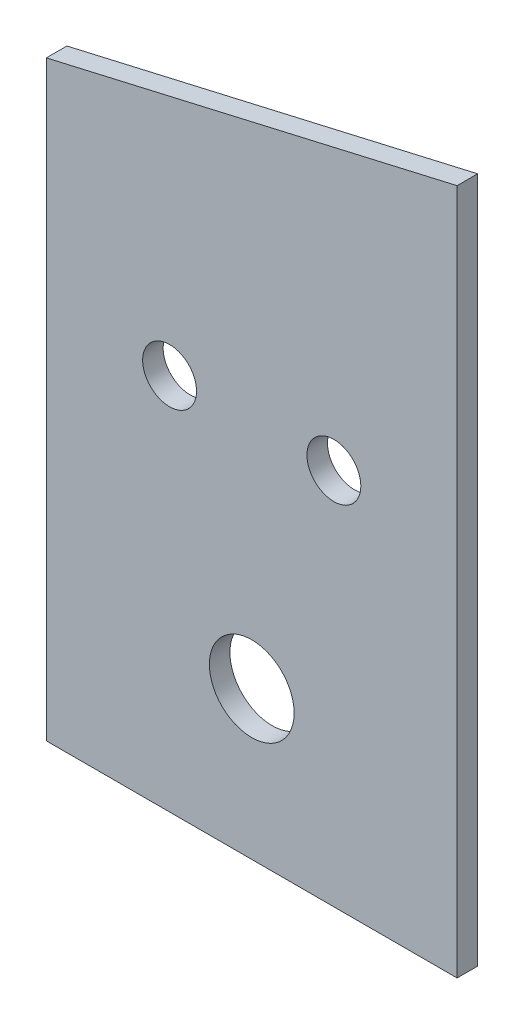
ISO-10303-21;
HEADER;
FILE_DESCRIPTION(('STEP AP214'),'2;1');
FILE_NAME('part.step','',(''),(''),'','','');
FILE_SCHEMA(('AUTOMOTIVE_DESIGN { 1 0 10303 214 1 1 1 1 }'));
ENDSEC;
DATA;
#1=APPLICATION_CONTEXT('core data for automotive mechanical design processes');
#2=APPLICATION_PROTOCOL_DEFINITION('international standard','automotive_design',2000,#1);
#3=PRODUCT_CONTEXT('',#1,'mechanical');
#4=PRODUCT('Part','Part','',(#3));
#5=PRODUCT_RELATED_PRODUCT_CATEGORY('part','',(#4));
#6=PRODUCT_DEFINITION_FORMATION('','',#4);
#7=PRODUCT_DEFINITION_CONTEXT('part definition',#1,'design');
#8=PRODUCT_DEFINITION('design','',#6,#7);
#9=PRODUCT_DEFINITION_SHAPE('','',#8);
#10=(LENGTH_UNIT() NAMED_UNIT(*) SI_UNIT(.MILLI.,.METRE.));
#11=(NAMED_UNIT(*) PLANE_ANGLE_UNIT() SI_UNIT($,.RADIAN.));
#12=(NAMED_UNIT(*) SI_UNIT($,.STERADIAN.) SOLID_ANGLE_UNIT());
#13=UNCERTAINTY_MEASURE_WITH_UNIT(LENGTH_MEASURE(1.E-05),#10,'distance_accuracy_value','');
#14=(GEOMETRIC_REPRESENTATION_CONTEXT(3) GLOBAL_UNCERTAINTY_ASSIGNED_CONTEXT((#13)) GLOBAL_UNIT_ASSIGNED_CONTEXT((#10,
#11,#12)) REPRESENTATION_CONTEXT('',''));
#15=CARTESIAN_POINT('',(0.,0.,0.));
#16=DIRECTION('',(0.,0.,1.));
#17=DIRECTION('',(1.,0.,0.));
#18=AXIS2_PLACEMENT_3D('',#15,#16,#17);
#19=CARTESIAN_POINT('',(31.75,0.,1.5875));
#20=DIRECTION('',(-1.,0.,0.));
#21=DIRECTION('',(0.,0.,1.));
#22=AXIS2_PLACEMENT_3D('',#19,#20,#21);
#23=PLANE('',#22);
#24=DIRECTION('',(0.,1.,0.));
#25=VECTOR('',#24,1.);
#26=CARTESIAN_POINT('',(31.75,0.,0.));
#27=LINE('',#26,#25);
#28=CARTESIAN_POINT('',(31.75,0.,0.));
#29=VERTEX_POINT('',#28);
#30=CARTESIAN_POINT('',(31.75,53.0410106947568,0.));
#31=VERTEX_POINT('',#30);
#32=EDGE_CURVE('E113',#29,#31,#27,.T.);
#33=ORIENTED_EDGE('',*,*,#32,.T.);
#34=DIRECTION('',(0.,0.,-1.));
#35=VECTOR('',#34,1.);
#36=CARTESIAN_POINT('',(31.75,53.0410106947568,1.5875));
#37=LINE('',#36,#35);
#38=CARTESIAN_POINT('',(31.75,53.0410106947568,1.5875));
#39=VERTEX_POINT('',#38);
#40=EDGE_CURVE('E11',#39,#31,#37,.T.);
#41=ORIENTED_EDGE('',*,*,#40,.F.);
#42=DIRECTION('',(0.,1.,0.));
#43=VECTOR('',#42,1.);
#44=CARTESIAN_POINT('',(31.75,0.,1.5875));
#45=LINE('',#44,#43);
#46=CARTESIAN_POINT('',(31.75,0.,1.5875));
#47=VERTEX_POINT('',#46);
#48=EDGE_CURVE('E80',#47,#39,#45,.T.);
#49=ORIENTED_EDGE('',*,*,#48,.F.);
#50=DIRECTION('',(0.,0.,-1.));
#51=VECTOR('',#50,1.);
#52=CARTESIAN_POINT('',(31.75,0.,1.5875));
#53=LINE('',#52,#51);
#54=EDGE_CURVE('E109',#47,#29,#53,.T.);
#55=ORIENTED_EDGE('',*,*,#54,.T.);
#56=EDGE_LOOP('',(#33,#41,#49,#55));
#57=FACE_BOUND('',#56,.T.);
#58=ADVANCED_FACE('F40',(#57),#23,.F.);
#59=CARTESIAN_POINT('',(-10.010036510487,43.4118556110809,1.5875));
#60=DIRECTION('',(-0.224687222520796,0.974430937540414,0.));
#61=DIRECTION('',(-0.974430937540414,-0.224687222520796,0.));
#62=AXIS2_PLACEMENT_3D('',#59,#60,#61);
#63=PLANE('',#62);
#64=DIRECTION('',(0.974430937540414,0.224687222520796,0.));
#65=VECTOR('',#64,1.);
#66=CARTESIAN_POINT('',(-10.010036510487,43.4118556110809,0.));
#67=LINE('',#66,#65);
#68=CARTESIAN_POINT('',(0.,45.72,0.));
#69=VERTEX_POINT('',#68);
#70=EDGE_CURVE('E89',#69,#31,#67,.T.);
#71=ORIENTED_EDGE('',*,*,#70,.F.);
#72=DIRECTION('',(0.,0.,-1.));
#73=VECTOR('',#72,1.);
#74=CARTESIAN_POINT('',(0.,45.72,1.5875));
#75=LINE('',#74,#73);
#76=CARTESIAN_POINT('',(0.,45.72,1.5875));
#77=VERTEX_POINT('',#76);
#78=EDGE_CURVE('E49',#77,#69,#75,.T.);
#79=ORIENTED_EDGE('',*,*,#78,.F.);
#80=DIRECTION('',(0.974430937540414,0.224687222520796,0.));
#81=VECTOR('',#80,1.);
#82=CARTESIAN_POINT('',(-10.010036510487,43.4118556110809,1.5875));
#83=LINE('',#82,#81);
#84=EDGE_CURVE('E87',#77,#39,#83,.T.);
#85=ORIENTED_EDGE('',*,*,#84,.T.);
#86=ORIENTED_EDGE('',*,*,#40,.T.);
#87=EDGE_LOOP('',(#71,#79,#85,#86));
#88=FACE_BOUND('',#87,.T.);
#89=ADVANCED_FACE('F86',(#88),#63,.T.);
#90=CARTESIAN_POINT('',(0.,0.,1.5875));
#91=DIRECTION('',(-1.,0.,0.));
#92=DIRECTION('',(0.,0.,1.));
#93=AXIS2_PLACEMENT_3D('',#90,#91,#92);
#94=PLANE('',#93);
#95=DIRECTION('',(0.,1.,0.));
#96=VECTOR('',#95,1.);
#97=CARTESIAN_POINT('',(0.,0.,0.));
#98=LINE('',#97,#96);
#99=CARTESIAN_POINT('',(0.,0.,0.));
#100=VERTEX_POINT('',#99);
#101=EDGE_CURVE('E117',#100,#69,#98,.T.);
#102=ORIENTED_EDGE('',*,*,#101,.F.);
#103=DIRECTION('',(0.,0.,-1.));
#104=VECTOR('',#103,1.);
#105=CARTESIAN_POINT('',(0.,0.,1.5875));
#106=LINE('',#105,#104);
#107=CARTESIAN_POINT('',(0.,0.,1.5875));
#108=VERTEX_POINT('',#107);
#109=EDGE_CURVE('E72',#108,#100,#106,.T.);
#110=ORIENTED_EDGE('',*,*,#109,.F.);
#111=DIRECTION('',(0.,1.,0.));
#112=VECTOR('',#111,1.);
#113=CARTESIAN_POINT('',(0.,0.,1.5875));
#114=LINE('',#113,#112);
#115=EDGE_CURVE('E96',#108,#77,#114,.T.);
#116=ORIENTED_EDGE('',*,*,#115,.T.);
#117=ORIENTED_EDGE('',*,*,#78,.T.);
#118=EDGE_LOOP('',(#102,#110,#116,#117));
#119=FACE_BOUND('',#118,.T.);
#120=ADVANCED_FACE('F98',(#119),#94,.T.);
#121=CARTESIAN_POINT('',(22.225,29.21,1.5875));
#122=DIRECTION('',(0.,0.,-1.));
#123=DIRECTION('',(-1.,0.,0.));
#124=AXIS2_PLACEMENT_3D('',#121,#122,#123);
#125=CYLINDRICAL_SURFACE('',#124,2.0828);
#126=CARTESIAN_POINT('',(22.225,29.21,1.5875));
#127=DIRECTION('',(0.,0.,1.));
#128=DIRECTION('',(1.,0.,0.));
#129=AXIS2_PLACEMENT_3D('',#126,#127,#128);
#130=CIRCLE('',#129,2.0828);
#131=CARTESIAN_POINT('',(24.3078,29.21,1.5875));
#132=VERTEX_POINT('',#131);
#133=EDGE_CURVE('E100',#132,#132,#130,.T.);
#134=ORIENTED_EDGE('',*,*,#133,.T.);
#135=EDGE_LOOP('',(#134));
#136=FACE_BOUND('',#135,.T.);
#137=CARTESIAN_POINT('',(22.225,29.21,0.));
#138=DIRECTION('',(0.,0.,1.));
#139=DIRECTION('',(1.,0.,0.));
#140=AXIS2_PLACEMENT_3D('',#137,#138,#139);
#141=CIRCLE('',#140,2.0828);
#142=CARTESIAN_POINT('',(24.3078,29.21,0.));
#143=VERTEX_POINT('',#142);
#144=EDGE_CURVE('E120',#143,#143,#141,.T.);
#145=ORIENTED_EDGE('',*,*,#144,.F.);
#146=EDGE_LOOP('',(#145));
#147=FACE_BOUND('',#146,.T.);
#148=ADVANCED_FACE('F161',(#136,#147),#125,.F.);
#149=CARTESIAN_POINT('',(0.,0.,1.5875));
#150=DIRECTION('',(0.,1.,0.));
#151=DIRECTION('',(0.,0.,1.));
#152=AXIS2_PLACEMENT_3D('',#149,#150,#151);
#153=PLANE('',#152);
#154=DIRECTION('',(1.,0.,0.));
#155=VECTOR('',#154,1.);
#156=CARTESIAN_POINT('',(0.,0.,0.));
#157=LINE('',#156,#155);
#158=EDGE_CURVE('E75',#100,#29,#157,.T.);
#159=ORIENTED_EDGE('',*,*,#158,.T.);
#160=ORIENTED_EDGE('',*,*,#54,.F.);
#161=DIRECTION('',(1.,0.,0.));
#162=VECTOR('',#161,1.);
#163=CARTESIAN_POINT('',(0.,0.,1.5875));
#164=LINE('',#163,#162);
#165=EDGE_CURVE('E57',#108,#47,#164,.T.);
#166=ORIENTED_EDGE('',*,*,#165,.F.);
#167=ORIENTED_EDGE('',*,*,#109,.T.);
#168=EDGE_LOOP('',(#159,#160,#166,#167));
#169=FACE_BOUND('',#168,.T.);
#170=ADVANCED_FACE('F150',(#169),#153,.F.);
#171=CARTESIAN_POINT('',(15.875,11.43,1.5875));
#172=DIRECTION('',(0.,0.,-1.));
#173=DIRECTION('',(-1.,0.,0.));
#174=AXIS2_PLACEMENT_3D('',#171,#172,#173);
#175=CYLINDRICAL_SURFACE('',#174,3.27660000000001);
#176=CARTESIAN_POINT('',(15.875,11.43,1.5875));
#177=DIRECTION('',(0.,0.,1.));
#178=DIRECTION('',(1.,0.,0.));
#179=AXIS2_PLACEMENT_3D('',#176,#177,#178);
#180=CIRCLE('',#179,3.27660000000001);
#181=CARTESIAN_POINT('',(19.1516,11.43,1.5875));
#182=VERTEX_POINT('',#181);
#183=EDGE_CURVE('E126',#182,#182,#180,.T.);
#184=ORIENTED_EDGE('',*,*,#183,.T.);
#185=EDGE_LOOP('',(#184));
#186=FACE_BOUND('',#185,.T.);
#187=CARTESIAN_POINT('',(15.875,11.43,0.));
#188=DIRECTION('',(0.,0.,1.));
#189=DIRECTION('',(1.,0.,0.));
#190=AXIS2_PLACEMENT_3D('',#187,#188,#189);
#191=CIRCLE('',#190,3.27660000000001);
#192=CARTESIAN_POINT('',(19.1516,11.43,0.));
#193=VERTEX_POINT('',#192);
#194=EDGE_CURVE('E110',#193,#193,#191,.T.);
#195=ORIENTED_EDGE('',*,*,#194,.F.);
#196=EDGE_LOOP('',(#195));
#197=FACE_BOUND('',#196,.T.);
#198=ADVANCED_FACE('F42',(#186,#197),#175,.F.);
#199=CARTESIAN_POINT('',(9.525,29.21,1.5875));
#200=DIRECTION('',(0.,0.,-1.));
#201=DIRECTION('',(-1.,0.,0.));
#202=AXIS2_PLACEMENT_3D('',#199,#200,#201);
#203=CYLINDRICAL_SURFACE('',#202,2.0828);
#204=CARTESIAN_POINT('',(9.525,29.21,1.5875));
#205=DIRECTION('',(0.,0.,1.));
#206=DIRECTION('',(1.,0.,0.));
#207=AXIS2_PLACEMENT_3D('',#204,#205,#206);
#208=CIRCLE('',#207,2.0828);
#209=CARTESIAN_POINT('',(11.6078,29.21,1.5875));
#210=VERTEX_POINT('',#209);
#211=EDGE_CURVE('E106',#210,#210,#208,.T.);
#212=ORIENTED_EDGE('',*,*,#211,.T.);
#213=EDGE_LOOP('',(#212));
#214=FACE_BOUND('',#213,.T.);
#215=CARTESIAN_POINT('',(9.525,29.21,0.));
#216=DIRECTION('',(0.,0.,1.));
#217=DIRECTION('',(1.,0.,0.));
#218=AXIS2_PLACEMENT_3D('',#215,#216,#217);
#219=CIRCLE('',#218,2.0828);
#220=CARTESIAN_POINT('',(11.6078,29.21,0.));
#221=VERTEX_POINT('',#220);
#222=EDGE_CURVE('E123',#221,#221,#219,.T.);
#223=ORIENTED_EDGE('',*,*,#222,.F.);
#224=EDGE_LOOP('',(#223));
#225=FACE_BOUND('',#224,.T.);
#226=ADVANCED_FACE('F140',(#214,#225),#203,.F.);
#227=CARTESIAN_POINT('',(0.,0.,1.5875));
#228=DIRECTION('',(0.,0.,1.));
#229=DIRECTION('',(1.,0.,0.));
#230=AXIS2_PLACEMENT_3D('',#227,#228,#229);
#231=PLANE('',#230);
#232=ORIENTED_EDGE('',*,*,#183,.F.);
#233=EDGE_LOOP('',(#232));
#234=FACE_BOUND('',#233,.T.);
#235=ORIENTED_EDGE('',*,*,#48,.T.);
#236=ORIENTED_EDGE('',*,*,#84,.F.);
#237=ORIENTED_EDGE('',*,*,#115,.F.);
#238=ORIENTED_EDGE('',*,*,#165,.T.);
#239=EDGE_LOOP('',(#235,#236,#237,#238));
#240=FACE_BOUND('',#239,.T.);
#241=ORIENTED_EDGE('',*,*,#133,.F.);
#242=EDGE_LOOP('',(#241));
#243=FACE_BOUND('',#242,.T.);
#244=ORIENTED_EDGE('',*,*,#211,.F.);
#245=EDGE_LOOP('',(#244));
#246=FACE_BOUND('',#245,.T.);
#247=ADVANCED_FACE('F94',(#234,#240,#243,#246),#231,.T.);
#248=CARTESIAN_POINT('',(0.,0.,0.));
#249=DIRECTION('',(0.,0.,1.));
#250=DIRECTION('',(1.,0.,0.));
#251=AXIS2_PLACEMENT_3D('',#248,#249,#250);
#252=PLANE('',#251);
#253=ORIENTED_EDGE('',*,*,#194,.T.);
#254=EDGE_LOOP('',(#253));
#255=FACE_BOUND('',#254,.T.);
#256=ORIENTED_EDGE('',*,*,#32,.F.);
#257=ORIENTED_EDGE('',*,*,#158,.F.);
#258=ORIENTED_EDGE('',*,*,#101,.T.);
#259=ORIENTED_EDGE('',*,*,#70,.T.);
#260=EDGE_LOOP('',(#256,#257,#258,#259));
#261=FACE_BOUND('',#260,.T.);
#262=ORIENTED_EDGE('',*,*,#144,.T.);
#263=EDGE_LOOP('',(#262));
#264=FACE_BOUND('',#263,.T.);
#265=ORIENTED_EDGE('',*,*,#222,.T.);
#266=EDGE_LOOP('',(#265));
#267=FACE_BOUND('',#266,.T.);
#268=ADVANCED_FACE('F131',(#255,#261,#264,#267),#252,.F.);
#269=CLOSED_SHELL('',(#58,#89,#120,#148,#170,#198,#226,#247,#268));
#270=MANIFOLD_SOLID_BREP('B2',#269);
#271=ADVANCED_BREP_SHAPE_REPRESENTATION('',(#18,#270),#14);
#272=SHAPE_DEFINITION_REPRESENTATION(#9,#271);
ENDSEC;
END-ISO-10303-21;
